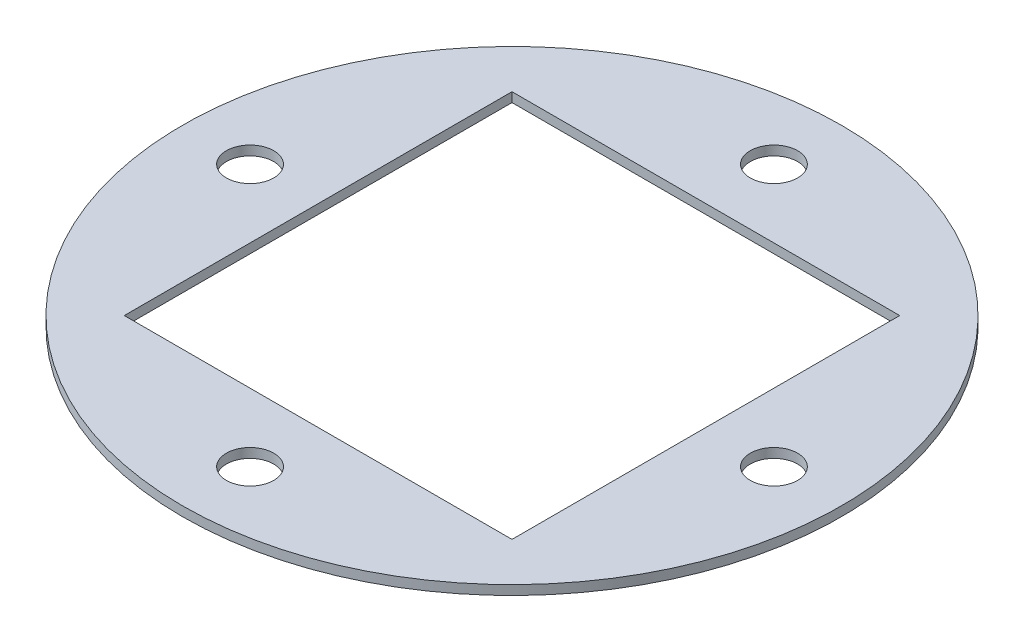
ISO-10303-21;
HEADER;
FILE_DESCRIPTION(('STEP AP214'),'2;1');
FILE_NAME('part.step','',(''),(''),'','','');
FILE_SCHEMA(('AUTOMOTIVE_DESIGN { 1 0 10303 214 1 1 1 1 }'));
ENDSEC;
DATA;
#1=APPLICATION_CONTEXT('core data for automotive mechanical design processes');
#2=APPLICATION_PROTOCOL_DEFINITION('international standard','automotive_design',2000,#1);
#3=PRODUCT_CONTEXT('',#1,'mechanical');
#4=PRODUCT('Part','Part','',(#3));
#5=PRODUCT_RELATED_PRODUCT_CATEGORY('part','',(#4));
#6=PRODUCT_DEFINITION_FORMATION('','',#4);
#7=PRODUCT_DEFINITION_CONTEXT('part definition',#1,'design');
#8=PRODUCT_DEFINITION('design','',#6,#7);
#9=PRODUCT_DEFINITION_SHAPE('','',#8);
#10=(LENGTH_UNIT() NAMED_UNIT(*) SI_UNIT(.MILLI.,.METRE.));
#11=(NAMED_UNIT(*) PLANE_ANGLE_UNIT() SI_UNIT($,.RADIAN.));
#12=(NAMED_UNIT(*) SI_UNIT($,.STERADIAN.) SOLID_ANGLE_UNIT());
#13=UNCERTAINTY_MEASURE_WITH_UNIT(LENGTH_MEASURE(1.E-05),#10,'distance_accuracy_value','');
#14=(GEOMETRIC_REPRESENTATION_CONTEXT(3) GLOBAL_UNCERTAINTY_ASSIGNED_CONTEXT((#13)) GLOBAL_UNIT_ASSIGNED_CONTEXT((#10,
#11,#12)) REPRESENTATION_CONTEXT('',''));
#15=CARTESIAN_POINT('',(0.,0.,0.));
#16=DIRECTION('',(0.,0.,1.));
#17=DIRECTION('',(1.,0.,0.));
#18=AXIS2_PLACEMENT_3D('',#15,#16,#17);
#19=CARTESIAN_POINT('',(0.,2.54,0.));
#20=DIRECTION('',(0.,1.,0.));
#21=DIRECTION('',(0.,0.,1.));
#22=AXIS2_PLACEMENT_3D('',#19,#20,#21);
#23=PLANE('',#22);
#24=CARTESIAN_POINT('',(0.,2.54,-70.358));
#25=DIRECTION('',(0.,1.,0.));
#26=DIRECTION('',(0.,0.,1.));
#27=AXIS2_PLACEMENT_3D('',#24,#25,#26);
#28=CIRCLE('',#27,6.35);
#29=CARTESIAN_POINT('',(0.,2.54,-64.008));
#30=VERTEX_POINT('',#29);
#31=EDGE_CURVE('E222',#30,#30,#28,.T.);
#32=ORIENTED_EDGE('',*,*,#31,.F.);
#33=EDGE_LOOP('',(#32));
#34=FACE_BOUND('',#33,.T.);
#35=CARTESIAN_POINT('',(70.358,2.54,2.45653644038325E-13));
#36=DIRECTION('',(0.,1.,0.));
#37=DIRECTION('',(0.,0.,1.));
#38=AXIS2_PLACEMENT_3D('',#35,#36,#37);
#39=CIRCLE('',#38,6.35);
#40=CARTESIAN_POINT('',(70.358,2.54,6.35000000000024));
#41=VERTEX_POINT('',#40);
#42=EDGE_CURVE('E224',#41,#41,#39,.T.);
#43=ORIENTED_EDGE('',*,*,#42,.F.);
#44=EDGE_LOOP('',(#43));
#45=FACE_BOUND('',#44,.T.);
#46=CARTESIAN_POINT('',(-4.9130728807665E-13,2.54,70.358));
#47=DIRECTION('',(0.,1.,0.));
#48=DIRECTION('',(0.,0.,1.));
#49=AXIS2_PLACEMENT_3D('',#46,#47,#48);
#50=CIRCLE('',#49,6.35);
#51=CARTESIAN_POINT('',(-4.9130728807665E-13,2.54,76.708));
#52=VERTEX_POINT('',#51);
#53=EDGE_CURVE('E236',#52,#52,#50,.T.);
#54=ORIENTED_EDGE('',*,*,#53,.F.);
#55=EDGE_LOOP('',(#54));
#56=FACE_BOUND('',#55,.T.);
#57=CARTESIAN_POINT('',(-70.358,2.54,-7.36960932114976E-13));
#58=DIRECTION('',(0.,1.,0.));
#59=DIRECTION('',(0.,0.,1.));
#60=AXIS2_PLACEMENT_3D('',#57,#58,#59);
#61=CIRCLE('',#60,6.35);
#62=CARTESIAN_POINT('',(-70.358,2.54,6.34999999999926));
#63=VERTEX_POINT('',#62);
#64=EDGE_CURVE('E244',#63,#63,#61,.T.);
#65=ORIENTED_EDGE('',*,*,#64,.F.);
#66=EDGE_LOOP('',(#65));
#67=FACE_BOUND('',#66,.T.);
#68=CARTESIAN_POINT('',(0.,2.54,0.));
#69=DIRECTION('',(0.,1.,0.));
#70=DIRECTION('',(0.,0.,1.));
#71=AXIS2_PLACEMENT_3D('',#68,#69,#70);
#72=CIRCLE('',#71,88.519);
#73=CARTESIAN_POINT('',(0.,2.54,88.519));
#74=VERTEX_POINT('',#73);
#75=EDGE_CURVE('E11',#74,#74,#72,.T.);
#76=ORIENTED_EDGE('',*,*,#75,.T.);
#77=EDGE_LOOP('',(#76));
#78=FACE_BOUND('',#77,.T.);
#79=DIRECTION('',(-1.,0.,0.));
#80=VECTOR('',#79,1.);
#81=CARTESIAN_POINT('',(-52.07,2.54,-52.07));
#82=LINE('',#81,#80);
#83=CARTESIAN_POINT('',(52.07,2.54,-52.07));
#84=VERTEX_POINT('',#83);
#85=CARTESIAN_POINT('',(-52.07,2.54,-52.07));
#86=VERTEX_POINT('',#85);
#87=EDGE_CURVE('E96',#84,#86,#82,.T.);
#88=ORIENTED_EDGE('',*,*,#87,.F.);
#89=DIRECTION('',(0.,0.,-1.));
#90=VECTOR('',#89,1.);
#91=CARTESIAN_POINT('',(52.07,2.54,-52.07));
#92=LINE('',#91,#90);
#93=CARTESIAN_POINT('',(52.07,2.54,52.07));
#94=VERTEX_POINT('',#93);
#95=EDGE_CURVE('E87',#94,#84,#92,.T.);
#96=ORIENTED_EDGE('',*,*,#95,.F.);
#97=DIRECTION('',(1.,0.,0.));
#98=VECTOR('',#97,1.);
#99=CARTESIAN_POINT('',(-52.07,2.54,52.07));
#100=LINE('',#99,#98);
#101=CARTESIAN_POINT('',(-52.07,2.54,52.07));
#102=VERTEX_POINT('',#101);
#103=EDGE_CURVE('E112',#102,#94,#100,.T.);
#104=ORIENTED_EDGE('',*,*,#103,.F.);
#105=DIRECTION('',(0.,0.,1.));
#106=VECTOR('',#105,1.);
#107=CARTESIAN_POINT('',(-52.07,2.54,-52.07));
#108=LINE('',#107,#106);
#109=EDGE_CURVE('E108',#86,#102,#108,.T.);
#110=ORIENTED_EDGE('',*,*,#109,.F.);
#111=EDGE_LOOP('',(#88,#96,#104,#110));
#112=FACE_BOUND('',#111,.T.);
#113=ADVANCED_FACE('F45',(#34,#45,#56,#67,#78,#112),#23,.T.);
#114=CARTESIAN_POINT('',(0.,0.,0.));
#115=DIRECTION('',(0.,1.,0.));
#116=DIRECTION('',(0.,0.,1.));
#117=AXIS2_PLACEMENT_3D('',#114,#115,#116);
#118=PLANE('',#117);
#119=CARTESIAN_POINT('',(0.,0.,-70.358));
#120=DIRECTION('',(0.,1.,0.));
#121=DIRECTION('',(0.,0.,1.));
#122=AXIS2_PLACEMENT_3D('',#119,#120,#121);
#123=CIRCLE('',#122,6.35);
#124=CARTESIAN_POINT('',(0.,0.,-64.008));
#125=VERTEX_POINT('',#124);
#126=EDGE_CURVE('E120',#125,#125,#123,.T.);
#127=ORIENTED_EDGE('',*,*,#126,.T.);
#128=EDGE_LOOP('',(#127));
#129=FACE_BOUND('',#128,.T.);
#130=CARTESIAN_POINT('',(70.358,0.,2.45653644038325E-13));
#131=DIRECTION('',(0.,1.,0.));
#132=DIRECTION('',(0.,0.,1.));
#133=AXIS2_PLACEMENT_3D('',#130,#131,#132);
#134=CIRCLE('',#133,6.35);
#135=CARTESIAN_POINT('',(70.358,0.,6.35000000000024));
#136=VERTEX_POINT('',#135);
#137=EDGE_CURVE('E230',#136,#136,#134,.T.);
#138=ORIENTED_EDGE('',*,*,#137,.T.);
#139=EDGE_LOOP('',(#138));
#140=FACE_BOUND('',#139,.T.);
#141=CARTESIAN_POINT('',(-4.9130728807665E-13,0.,70.358));
#142=DIRECTION('',(0.,1.,0.));
#143=DIRECTION('',(0.,0.,1.));
#144=AXIS2_PLACEMENT_3D('',#141,#142,#143);
#145=CIRCLE('',#144,6.35);
#146=CARTESIAN_POINT('',(-4.9130728807665E-13,0.,76.708));
#147=VERTEX_POINT('',#146);
#148=EDGE_CURVE('E240',#147,#147,#145,.T.);
#149=ORIENTED_EDGE('',*,*,#148,.T.);
#150=EDGE_LOOP('',(#149));
#151=FACE_BOUND('',#150,.T.);
#152=CARTESIAN_POINT('',(-70.358,0.,-7.36960932114976E-13));
#153=DIRECTION('',(0.,1.,0.));
#154=DIRECTION('',(0.,0.,1.));
#155=AXIS2_PLACEMENT_3D('',#152,#153,#154);
#156=CIRCLE('',#155,6.35);
#157=CARTESIAN_POINT('',(-70.358,0.,6.34999999999926));
#158=VERTEX_POINT('',#157);
#159=EDGE_CURVE('E247',#158,#158,#156,.T.);
#160=ORIENTED_EDGE('',*,*,#159,.T.);
#161=EDGE_LOOP('',(#160));
#162=FACE_BOUND('',#161,.T.);
#163=CARTESIAN_POINT('',(0.,0.,0.));
#164=DIRECTION('',(0.,1.,0.));
#165=DIRECTION('',(0.,0.,1.));
#166=AXIS2_PLACEMENT_3D('',#163,#164,#165);
#167=CIRCLE('',#166,88.519);
#168=CARTESIAN_POINT('',(0.,0.,88.519));
#169=VERTEX_POINT('',#168);
#170=EDGE_CURVE('E49',#169,#169,#167,.T.);
#171=ORIENTED_EDGE('',*,*,#170,.F.);
#172=EDGE_LOOP('',(#171));
#173=FACE_BOUND('',#172,.T.);
#174=DIRECTION('',(0.,0.,-1.));
#175=VECTOR('',#174,1.);
#176=CARTESIAN_POINT('',(52.07,0.,-52.07));
#177=LINE('',#176,#175);
#178=CARTESIAN_POINT('',(52.07,0.,52.07));
#179=VERTEX_POINT('',#178);
#180=CARTESIAN_POINT('',(52.07,0.,-52.07));
#181=VERTEX_POINT('',#180);
#182=EDGE_CURVE('E69',#179,#181,#177,.T.);
#183=ORIENTED_EDGE('',*,*,#182,.T.);
#184=DIRECTION('',(-1.,0.,0.));
#185=VECTOR('',#184,1.);
#186=CARTESIAN_POINT('',(-52.07,0.,-52.07));
#187=LINE('',#186,#185);
#188=CARTESIAN_POINT('',(-52.07,0.,-52.07));
#189=VERTEX_POINT('',#188);
#190=EDGE_CURVE('E103',#181,#189,#187,.T.);
#191=ORIENTED_EDGE('',*,*,#190,.T.);
#192=DIRECTION('',(0.,0.,1.));
#193=VECTOR('',#192,1.);
#194=CARTESIAN_POINT('',(-52.07,0.,-52.07));
#195=LINE('',#194,#193);
#196=CARTESIAN_POINT('',(-52.07,0.,52.07));
#197=VERTEX_POINT('',#196);
#198=EDGE_CURVE('E123',#189,#197,#195,.T.);
#199=ORIENTED_EDGE('',*,*,#198,.T.);
#200=DIRECTION('',(1.,0.,0.));
#201=VECTOR('',#200,1.);
#202=CARTESIAN_POINT('',(-52.07,0.,52.07));
#203=LINE('',#202,#201);
#204=EDGE_CURVE('E97',#197,#179,#203,.T.);
#205=ORIENTED_EDGE('',*,*,#204,.T.);
#206=EDGE_LOOP('',(#183,#191,#199,#205));
#207=FACE_BOUND('',#206,.T.);
#208=ADVANCED_FACE('F139',(#129,#140,#151,#162,#173,#207),#118,.F.);
#209=CARTESIAN_POINT('',(0.,2.54,0.));
#210=DIRECTION('',(0.,-1.,0.));
#211=DIRECTION('',(0.,0.,-1.));
#212=AXIS2_PLACEMENT_3D('',#209,#210,#211);
#213=CYLINDRICAL_SURFACE('',#212,88.519);
#214=ORIENTED_EDGE('',*,*,#75,.F.);
#215=EDGE_LOOP('',(#214));
#216=FACE_BOUND('',#215,.T.);
#217=ORIENTED_EDGE('',*,*,#170,.T.);
#218=EDGE_LOOP('',(#217));
#219=FACE_BOUND('',#218,.T.);
#220=ADVANCED_FACE('F47',(#216,#219),#213,.T.);
#221=CARTESIAN_POINT('',(52.07,2.54,-52.07));
#222=DIRECTION('',(-1.,0.,0.));
#223=DIRECTION('',(0.,0.,1.));
#224=AXIS2_PLACEMENT_3D('',#221,#222,#223);
#225=PLANE('',#224);
#226=ORIENTED_EDGE('',*,*,#182,.F.);
#227=DIRECTION('',(0.,-1.,0.));
#228=VECTOR('',#227,1.);
#229=CARTESIAN_POINT('',(52.07,2.54,52.07));
#230=LINE('',#229,#228);
#231=EDGE_CURVE('E91',#94,#179,#230,.T.);
#232=ORIENTED_EDGE('',*,*,#231,.F.);
#233=ORIENTED_EDGE('',*,*,#95,.T.);
#234=DIRECTION('',(0.,-1.,0.));
#235=VECTOR('',#234,1.);
#236=CARTESIAN_POINT('',(52.07,2.54,-52.07));
#237=LINE('',#236,#235);
#238=EDGE_CURVE('E90',#84,#181,#237,.T.);
#239=ORIENTED_EDGE('',*,*,#238,.T.);
#240=EDGE_LOOP('',(#226,#232,#233,#239));
#241=FACE_BOUND('',#240,.T.);
#242=ADVANCED_FACE('F89',(#241),#225,.T.);
#243=CARTESIAN_POINT('',(-52.07,2.54,-52.07));
#244=DIRECTION('',(0.,0.,1.));
#245=DIRECTION('',(1.,0.,0.));
#246=AXIS2_PLACEMENT_3D('',#243,#244,#245);
#247=PLANE('',#246);
#248=ORIENTED_EDGE('',*,*,#190,.F.);
#249=ORIENTED_EDGE('',*,*,#238,.F.);
#250=ORIENTED_EDGE('',*,*,#87,.T.);
#251=DIRECTION('',(0.,-1.,0.));
#252=VECTOR('',#251,1.);
#253=CARTESIAN_POINT('',(-52.07,2.54,-52.07));
#254=LINE('',#253,#252);
#255=EDGE_CURVE('E105',#86,#189,#254,.T.);
#256=ORIENTED_EDGE('',*,*,#255,.T.);
#257=EDGE_LOOP('',(#248,#249,#250,#256));
#258=FACE_BOUND('',#257,.T.);
#259=ADVANCED_FACE('F100',(#258),#247,.T.);
#260=CARTESIAN_POINT('',(-52.07,2.54,-52.07));
#261=DIRECTION('',(1.,0.,0.));
#262=DIRECTION('',(0.,0.,-1.));
#263=AXIS2_PLACEMENT_3D('',#260,#261,#262);
#264=PLANE('',#263);
#265=ORIENTED_EDGE('',*,*,#198,.F.);
#266=ORIENTED_EDGE('',*,*,#255,.F.);
#267=ORIENTED_EDGE('',*,*,#109,.T.);
#268=DIRECTION('',(0.,-1.,0.));
#269=VECTOR('',#268,1.);
#270=CARTESIAN_POINT('',(-52.07,2.54,52.07));
#271=LINE('',#270,#269);
#272=EDGE_CURVE('E61',#102,#197,#271,.T.);
#273=ORIENTED_EDGE('',*,*,#272,.T.);
#274=EDGE_LOOP('',(#265,#266,#267,#273));
#275=FACE_BOUND('',#274,.T.);
#276=ADVANCED_FACE('F137',(#275),#264,.T.);
#277=CARTESIAN_POINT('',(-52.07,2.54,52.07));
#278=DIRECTION('',(0.,0.,-1.));
#279=DIRECTION('',(-1.,0.,0.));
#280=AXIS2_PLACEMENT_3D('',#277,#278,#279);
#281=PLANE('',#280);
#282=ORIENTED_EDGE('',*,*,#204,.F.);
#283=ORIENTED_EDGE('',*,*,#272,.F.);
#284=ORIENTED_EDGE('',*,*,#103,.T.);
#285=ORIENTED_EDGE('',*,*,#231,.T.);
#286=EDGE_LOOP('',(#282,#283,#284,#285));
#287=FACE_BOUND('',#286,.T.);
#288=ADVANCED_FACE('F140',(#287),#281,.T.);
#289=CARTESIAN_POINT('',(-70.358,0.,-7.36960932114976E-13));
#290=DIRECTION('',(0.,1.,0.));
#291=DIRECTION('',(0.,0.,1.));
#292=AXIS2_PLACEMENT_3D('',#289,#290,#291);
#293=CYLINDRICAL_SURFACE('',#292,6.35);
#294=ORIENTED_EDGE('',*,*,#159,.F.);
#295=EDGE_LOOP('',(#294));
#296=FACE_BOUND('',#295,.T.);
#297=ORIENTED_EDGE('',*,*,#64,.T.);
#298=EDGE_LOOP('',(#297));
#299=FACE_BOUND('',#298,.T.);
#300=ADVANCED_FACE('F142',(#296,#299),#293,.F.);
#301=CARTESIAN_POINT('',(-4.9130728807665E-13,0.,70.358));
#302=DIRECTION('',(0.,1.,0.));
#303=DIRECTION('',(0.,0.,1.));
#304=AXIS2_PLACEMENT_3D('',#301,#302,#303);
#305=CYLINDRICAL_SURFACE('',#304,6.35);
#306=ORIENTED_EDGE('',*,*,#148,.F.);
#307=EDGE_LOOP('',(#306));
#308=FACE_BOUND('',#307,.T.);
#309=ORIENTED_EDGE('',*,*,#53,.T.);
#310=EDGE_LOOP('',(#309));
#311=FACE_BOUND('',#310,.T.);
#312=ADVANCED_FACE('F149',(#308,#311),#305,.F.);
#313=CARTESIAN_POINT('',(70.358,0.,2.45653644038325E-13));
#314=DIRECTION('',(0.,1.,0.));
#315=DIRECTION('',(0.,0.,1.));
#316=AXIS2_PLACEMENT_3D('',#313,#314,#315);
#317=CYLINDRICAL_SURFACE('',#316,6.35);
#318=ORIENTED_EDGE('',*,*,#137,.F.);
#319=EDGE_LOOP('',(#318));
#320=FACE_BOUND('',#319,.T.);
#321=ORIENTED_EDGE('',*,*,#42,.T.);
#322=EDGE_LOOP('',(#321));
#323=FACE_BOUND('',#322,.T.);
#324=ADVANCED_FACE('F195',(#320,#323),#317,.F.);
#325=CARTESIAN_POINT('',(0.,0.,-70.358));
#326=DIRECTION('',(0.,1.,0.));
#327=DIRECTION('',(0.,0.,1.));
#328=AXIS2_PLACEMENT_3D('',#325,#326,#327);
#329=CYLINDRICAL_SURFACE('',#328,6.35);
#330=ORIENTED_EDGE('',*,*,#126,.F.);
#331=EDGE_LOOP('',(#330));
#332=FACE_BOUND('',#331,.T.);
#333=ORIENTED_EDGE('',*,*,#31,.T.);
#334=EDGE_LOOP('',(#333));
#335=FACE_BOUND('',#334,.T.);
#336=ADVANCED_FACE('F205',(#332,#335),#329,.F.);
#337=CLOSED_SHELL('',(#113,#208,#220,#242,#259,#276,#288,#300,#312,#324,#336));
#338=MANIFOLD_SOLID_BREP('B2',#337);
#339=ADVANCED_BREP_SHAPE_REPRESENTATION('',(#18,#338),#14);
#340=SHAPE_DEFINITION_REPRESENTATION(#9,#339);
ENDSEC;
END-ISO-10303-21;
